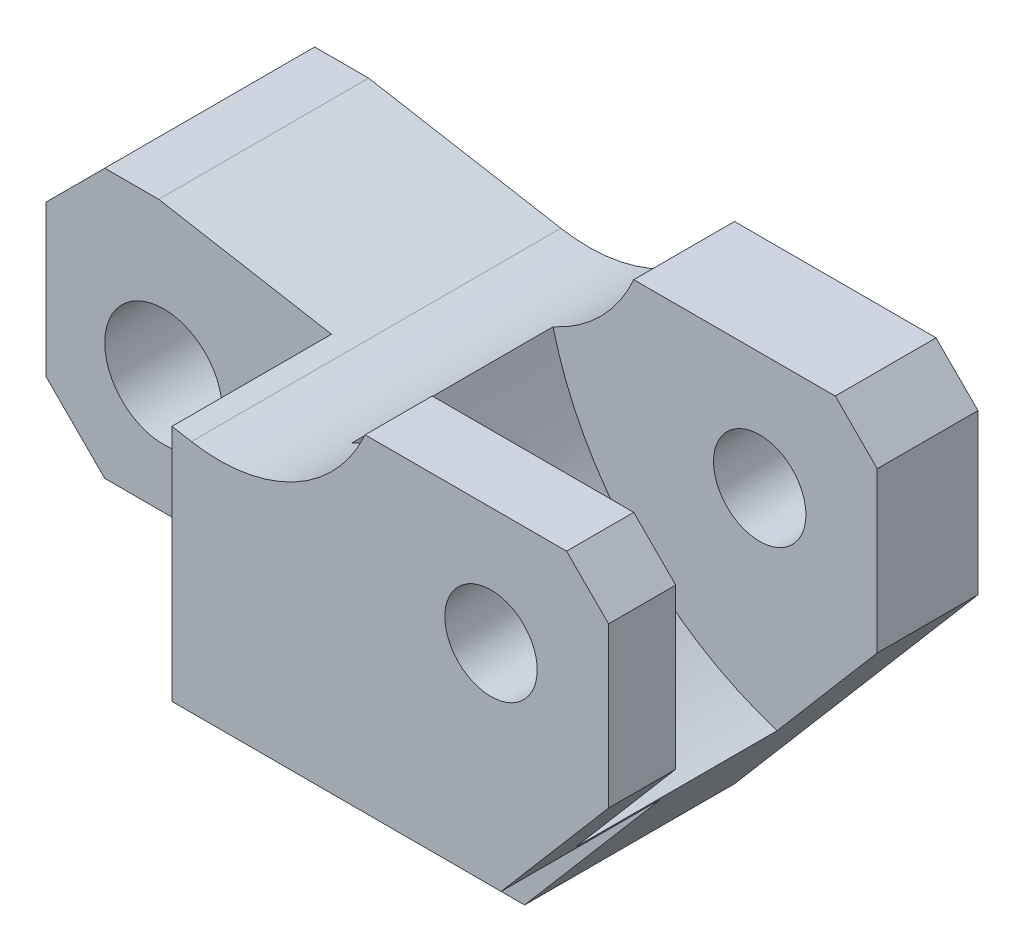
ISO-10303-21;
HEADER;
FILE_DESCRIPTION(('STEP AP214'),'2;1');
FILE_NAME('part.step','',(''),(''),'','','');
FILE_SCHEMA(('AUTOMOTIVE_DESIGN { 1 0 10303 214 1 1 1 1 }'));
ENDSEC;
DATA;
#1=APPLICATION_CONTEXT('core data for automotive mechanical design processes');
#2=APPLICATION_PROTOCOL_DEFINITION('international standard','automotive_design',2000,#1);
#3=PRODUCT_CONTEXT('',#1,'mechanical');
#4=PRODUCT('Part','Part','',(#3));
#5=PRODUCT_RELATED_PRODUCT_CATEGORY('part','',(#4));
#6=PRODUCT_DEFINITION_FORMATION('','',#4);
#7=PRODUCT_DEFINITION_CONTEXT('part definition',#1,'design');
#8=PRODUCT_DEFINITION('design','',#6,#7);
#9=PRODUCT_DEFINITION_SHAPE('','',#8);
#10=(LENGTH_UNIT() NAMED_UNIT(*) SI_UNIT(.MILLI.,.METRE.));
#11=(NAMED_UNIT(*) PLANE_ANGLE_UNIT() SI_UNIT($,.RADIAN.));
#12=(NAMED_UNIT(*) SI_UNIT($,.STERADIAN.) SOLID_ANGLE_UNIT());
#13=UNCERTAINTY_MEASURE_WITH_UNIT(LENGTH_MEASURE(1.E-05),#10,'distance_accuracy_value','');
#14=(GEOMETRIC_REPRESENTATION_CONTEXT(3) GLOBAL_UNCERTAINTY_ASSIGNED_CONTEXT((#13)) GLOBAL_UNIT_ASSIGNED_CONTEXT((#10,
#11,#12)) REPRESENTATION_CONTEXT('',''));
#15=CARTESIAN_POINT('',(0.,0.,0.));
#16=DIRECTION('',(0.,0.,1.));
#17=DIRECTION('',(1.,0.,0.));
#18=AXIS2_PLACEMENT_3D('',#15,#16,#17);
#19=CARTESIAN_POINT('',(79.,34.0000000000003,44.));
#20=DIRECTION('',(-1.,0.,0.));
#21=DIRECTION('',(0.,0.,1.));
#22=AXIS2_PLACEMENT_3D('',#19,#20,#21);
#23=PLANE('',#22);
#24=DIRECTION('',(0.,0.,-1.));
#25=VECTOR('',#24,1.);
#26=CARTESIAN_POINT('',(79.,15.0000000000003,44.));
#27=LINE('',#26,#25);
#28=CARTESIAN_POINT('',(79.,15.0000000000003,44.));
#29=VERTEX_POINT('',#28);
#30=CARTESIAN_POINT('',(79.,15.0000000000003,36.));
#31=VERTEX_POINT('',#30);
#32=EDGE_CURVE('E453',#29,#31,#27,.T.);
#33=ORIENTED_EDGE('',*,*,#32,.T.);
#34=DIRECTION('',(0.,1.,0.));
#35=VECTOR('',#34,1.);
#36=CARTESIAN_POINT('',(79.,34.0000000000003,36.));
#37=LINE('',#36,#35);
#38=CARTESIAN_POINT('',(79.,34.0000000000003,36.));
#39=VERTEX_POINT('',#38);
#40=EDGE_CURVE('E332',#31,#39,#37,.T.);
#41=ORIENTED_EDGE('',*,*,#40,.T.);
#42=DIRECTION('',(0.,0.,-1.));
#43=VECTOR('',#42,1.);
#44=CARTESIAN_POINT('',(79.,34.0000000000003,44.));
#45=LINE('',#44,#43);
#46=CARTESIAN_POINT('',(79.,34.0000000000003,44.));
#47=VERTEX_POINT('',#46);
#48=EDGE_CURVE('E448',#47,#39,#45,.T.);
#49=ORIENTED_EDGE('',*,*,#48,.F.);
#50=DIRECTION('',(0.,1.,0.));
#51=VECTOR('',#50,1.);
#52=CARTESIAN_POINT('',(79.,34.0000000000003,44.));
#53=LINE('',#52,#51);
#54=EDGE_CURVE('E351',#29,#47,#53,.T.);
#55=ORIENTED_EDGE('',*,*,#54,.F.);
#56=EDGE_LOOP('',(#33,#41,#49,#55));
#57=FACE_BOUND('',#56,.T.);
#58=ADVANCED_FACE('F40',(#57),#23,.F.);
#59=CARTESIAN_POINT('',(74.,39.0000000000003,44.));
#60=DIRECTION('',(-0.707106781186547,-0.707106781186548,0.));
#61=DIRECTION('',(0.707106781186548,-0.707106781186547,0.));
#62=AXIS2_PLACEMENT_3D('',#59,#60,#61);
#63=PLANE('',#62);
#64=ORIENTED_EDGE('',*,*,#48,.T.);
#65=DIRECTION('',(-0.707106781186548,0.707106781186547,0.));
#66=VECTOR('',#65,1.);
#67=CARTESIAN_POINT('',(74.,39.0000000000003,36.));
#68=LINE('',#67,#66);
#69=CARTESIAN_POINT('',(74.,39.0000000000003,36.));
#70=VERTEX_POINT('',#69);
#71=EDGE_CURVE('E328',#39,#70,#68,.T.);
#72=ORIENTED_EDGE('',*,*,#71,.T.);
#73=DIRECTION('',(0.,0.,-1.));
#74=VECTOR('',#73,1.);
#75=CARTESIAN_POINT('',(74.,39.0000000000003,44.));
#76=LINE('',#75,#74);
#77=CARTESIAN_POINT('',(74.,39.0000000000003,44.));
#78=VERTEX_POINT('',#77);
#79=EDGE_CURVE('E443',#78,#70,#76,.T.);
#80=ORIENTED_EDGE('',*,*,#79,.F.);
#81=DIRECTION('',(-0.707106781186548,0.707106781186547,0.));
#82=VECTOR('',#81,1.);
#83=CARTESIAN_POINT('',(74.,39.0000000000003,44.));
#84=LINE('',#83,#82);
#85=EDGE_CURVE('E354',#47,#78,#84,.T.);
#86=ORIENTED_EDGE('',*,*,#85,.F.);
#87=EDGE_LOOP('',(#64,#72,#80,#86));
#88=FACE_BOUND('',#87,.T.);
#89=ADVANCED_FACE('F546',(#88),#63,.F.);
#90=CARTESIAN_POINT('',(50.,39.0000000000003,44.));
#91=DIRECTION('',(0.,-1.,0.));
#92=DIRECTION('',(1.,0.,0.));
#93=AXIS2_PLACEMENT_3D('',#90,#91,#92);
#94=PLANE('',#93);
#95=ORIENTED_EDGE('',*,*,#79,.T.);
#96=DIRECTION('',(-1.,0.,0.));
#97=VECTOR('',#96,1.);
#98=CARTESIAN_POINT('',(50.,39.0000000000003,36.));
#99=LINE('',#98,#97);
#100=CARTESIAN_POINT('',(50.,39.0000000000003,36.));
#101=VERTEX_POINT('',#100);
#102=EDGE_CURVE('E324',#70,#101,#99,.T.);
#103=ORIENTED_EDGE('',*,*,#102,.T.);
#104=DIRECTION('',(0.,0.,-1.));
#105=VECTOR('',#104,1.);
#106=CARTESIAN_POINT('',(50.,39.0000000000003,44.));
#107=LINE('',#106,#105);
#108=CARTESIAN_POINT('',(50.,39.0000000000003,44.));
#109=VERTEX_POINT('',#108);
#110=EDGE_CURVE('E438',#109,#101,#107,.T.);
#111=ORIENTED_EDGE('',*,*,#110,.F.);
#112=DIRECTION('',(-1.,0.,0.));
#113=VECTOR('',#112,1.);
#114=CARTESIAN_POINT('',(50.,39.0000000000003,44.));
#115=LINE('',#114,#113);
#116=EDGE_CURVE('E357',#78,#109,#115,.T.);
#117=ORIENTED_EDGE('',*,*,#116,.F.);
#118=EDGE_LOOP('',(#95,#103,#111,#117));
#119=FACE_BOUND('',#118,.T.);
#120=ADVANCED_FACE('F543',(#119),#94,.F.);
#121=CARTESIAN_POINT('',(32.6187452989159,46.6741113502506,44.));
#122=DIRECTION('',(0.,0.,-1.));
#123=DIRECTION('',(-1.,0.,0.));
#124=AXIS2_PLACEMENT_3D('',#121,#122,#123);
#125=PLANE('',#124);
#126=CARTESIAN_POINT('',(65.,25.0000000000003,44.));
#127=DIRECTION('',(0.,0.,1.));
#128=DIRECTION('',(1.,0.,0.));
#129=AXIS2_PLACEMENT_3D('',#126,#127,#128);
#130=CIRCLE('',#129,5.5);
#131=CARTESIAN_POINT('',(70.5,25.0000000000003,44.));
#132=VERTEX_POINT('',#131);
#133=EDGE_CURVE('E249',#132,#132,#130,.T.);
#134=ORIENTED_EDGE('',*,*,#133,.F.);
#135=EDGE_LOOP('',(#134));
#136=FACE_BOUND('',#135,.T.);
#137=DIRECTION('',(1.,0.,0.));
#138=VECTOR('',#137,1.);
#139=CARTESIAN_POINT('',(32.9488407975828,0.,44.));
#140=LINE('',#139,#138);
#141=CARTESIAN_POINT('',(27.,0.,44.));
#142=VERTEX_POINT('',#141);
#143=CARTESIAN_POINT('',(66.2058823529412,2.84494650060196E-13,44.));
#144=VERTEX_POINT('',#143);
#145=EDGE_CURVE('E344',#142,#144,#140,.T.);
#146=ORIENTED_EDGE('',*,*,#145,.T.);
#147=DIRECTION('',(0.64894660608275,0.760833951959086,0.));
#148=VECTOR('',#147,1.);
#149=CARTESIAN_POINT('',(79.,15.0000000000003,44.));
#150=LINE('',#149,#148);
#151=EDGE_CURVE('E347',#144,#29,#150,.T.);
#152=ORIENTED_EDGE('',*,*,#151,.T.);
#153=ORIENTED_EDGE('',*,*,#54,.T.);
#154=ORIENTED_EDGE('',*,*,#85,.T.);
#155=ORIENTED_EDGE('',*,*,#116,.T.);
#156=CARTESIAN_POINT('',(32.6187452989159,46.6741113502506,44.));
#157=DIRECTION('',(0.,0.,-1.));
#158=DIRECTION('',(-1.,0.,0.));
#159=AXIS2_PLACEMENT_3D('',#156,#157,#158);
#160=CIRCLE('',#159,19.);
#161=CARTESIAN_POINT('',(29.3194299232442,27.9627640430187,44.));
#162=VERTEX_POINT('',#161);
#163=EDGE_CURVE('E360',#109,#162,#160,.T.);
#164=ORIENTED_EDGE('',*,*,#163,.T.);
#165=DIRECTION('',(-0.984807753012208,0.17364817766693,0.));
#166=VECTOR('',#165,1.);
#167=CARTESIAN_POINT('',(6.42312703890897,32.,44.));
#168=LINE('',#167,#166);
#169=CARTESIAN_POINT('',(27.,28.3717421183492,44.));
#170=VERTEX_POINT('',#169);
#171=EDGE_CURVE('E363',#162,#170,#168,.T.);
#172=ORIENTED_EDGE('',*,*,#171,.T.);
#173=DIRECTION('',(0.,1.,0.));
#174=VECTOR('',#173,1.);
#175=CARTESIAN_POINT('',(27.,-3.99999999999971,44.));
#176=LINE('',#175,#174);
#177=EDGE_CURVE('E255',#142,#170,#176,.T.);
#178=ORIENTED_EDGE('',*,*,#177,.F.);
#179=EDGE_LOOP('',(#146,#152,#153,#154,#155,#164,#172,#178));
#180=FACE_BOUND('',#179,.T.);
#181=ADVANCED_FACE('F487',(#136,#180),#125,.F.);
#182=CARTESIAN_POINT('',(32.6187452989159,46.6741113502506,0.));
#183=DIRECTION('',(0.,0.,-1.));
#184=DIRECTION('',(-1.,0.,0.));
#185=AXIS2_PLACEMENT_3D('',#182,#183,#184);
#186=PLANE('',#185);
#187=CARTESIAN_POINT('',(65.,25.0000000000003,0.));
#188=DIRECTION('',(0.,0.,1.));
#189=DIRECTION('',(1.,0.,0.));
#190=AXIS2_PLACEMENT_3D('',#187,#188,#189);
#191=CIRCLE('',#190,5.5);
#192=CARTESIAN_POINT('',(70.5,25.0000000000003,0.));
#193=VERTEX_POINT('',#192);
#194=EDGE_CURVE('E213',#193,#193,#191,.T.);
#195=ORIENTED_EDGE('',*,*,#194,.T.);
#196=EDGE_LOOP('',(#195));
#197=FACE_BOUND('',#196,.T.);
#198=DIRECTION('',(1.,0.,0.));
#199=VECTOR('',#198,1.);
#200=CARTESIAN_POINT('',(32.9488407975828,0.,0.));
#201=LINE('',#200,#199);
#202=CARTESIAN_POINT('',(0.,0.,0.));
#203=VERTEX_POINT('',#202);
#204=CARTESIAN_POINT('',(32.9488407975828,0.,0.));
#205=VERTEX_POINT('',#204);
#206=EDGE_CURVE('E218',#203,#205,#201,.T.);
#207=ORIENTED_EDGE('',*,*,#206,.F.);
#208=DIRECTION('',(0.707106781186549,-0.707106781186546,0.));
#209=VECTOR('',#208,1.);
#210=CARTESIAN_POINT('',(0.,0.,0.));
#211=LINE('',#210,#209);
#212=CARTESIAN_POINT('',(-7.,6.99999999999997,0.));
#213=VERTEX_POINT('',#212);
#214=EDGE_CURVE('E348',#213,#203,#211,.T.);
#215=ORIENTED_EDGE('',*,*,#214,.F.);
#216=DIRECTION('',(0.,-1.,0.));
#217=VECTOR('',#216,1.);
#218=CARTESIAN_POINT('',(-7.,6.99999999999997,0.));
#219=LINE('',#218,#217);
#220=CARTESIAN_POINT('',(-7.,25.,0.));
#221=VERTEX_POINT('',#220);
#222=EDGE_CURVE('E412',#221,#213,#219,.T.);
#223=ORIENTED_EDGE('',*,*,#222,.F.);
#224=DIRECTION('',(-0.707106781186546,-0.707106781186549,0.));
#225=VECTOR('',#224,1.);
#226=CARTESIAN_POINT('',(-7.,25.,0.));
#227=LINE('',#226,#225);
#228=CARTESIAN_POINT('',(0.,32.,0.));
#229=VERTEX_POINT('',#228);
#230=EDGE_CURVE('E408',#229,#221,#227,.T.);
#231=ORIENTED_EDGE('',*,*,#230,.F.);
#232=DIRECTION('',(-1.,0.,0.));
#233=VECTOR('',#232,1.);
#234=CARTESIAN_POINT('',(0.,32.,0.));
#235=LINE('',#234,#233);
#236=CARTESIAN_POINT('',(6.42312703890897,32.,0.));
#237=VERTEX_POINT('',#236);
#238=EDGE_CURVE('E404',#237,#229,#235,.T.);
#239=ORIENTED_EDGE('',*,*,#238,.F.);
#240=DIRECTION('',(-0.984807753012208,0.17364817766693,0.));
#241=VECTOR('',#240,1.);
#242=CARTESIAN_POINT('',(6.42312703890897,32.,0.));
#243=LINE('',#242,#241);
#244=CARTESIAN_POINT('',(29.3194299232442,27.9627640430187,0.));
#245=VERTEX_POINT('',#244);
#246=EDGE_CURVE('E400',#245,#237,#243,.T.);
#247=ORIENTED_EDGE('',*,*,#246,.F.);
#248=CARTESIAN_POINT('',(32.6187452989159,46.6741113502506,0.));
#249=DIRECTION('',(0.,0.,-1.));
#250=DIRECTION('',(-1.,0.,0.));
#251=AXIS2_PLACEMENT_3D('',#248,#249,#250);
#252=CIRCLE('',#251,19.);
#253=CARTESIAN_POINT('',(50.,39.0000000000003,0.));
#254=VERTEX_POINT('',#253);
#255=EDGE_CURVE('E397',#254,#245,#252,.T.);
#256=ORIENTED_EDGE('',*,*,#255,.F.);
#257=DIRECTION('',(-1.,0.,0.));
#258=VECTOR('',#257,1.);
#259=CARTESIAN_POINT('',(50.,39.0000000000003,0.));
#260=LINE('',#259,#258);
#261=CARTESIAN_POINT('',(74.,39.0000000000003,0.));
#262=VERTEX_POINT('',#261);
#263=EDGE_CURVE('E393',#262,#254,#260,.T.);
#264=ORIENTED_EDGE('',*,*,#263,.F.);
#265=DIRECTION('',(-0.707106781186548,0.707106781186547,0.));
#266=VECTOR('',#265,1.);
#267=CARTESIAN_POINT('',(74.,39.0000000000003,0.));
#268=LINE('',#267,#266);
#269=CARTESIAN_POINT('',(79.,34.0000000000003,0.));
#270=VERTEX_POINT('',#269);
#271=EDGE_CURVE('E389',#270,#262,#268,.T.);
#272=ORIENTED_EDGE('',*,*,#271,.F.);
#273=DIRECTION('',(0.,1.,0.));
#274=VECTOR('',#273,1.);
#275=CARTESIAN_POINT('',(79.,34.0000000000003,0.));
#276=LINE('',#275,#274);
#277=CARTESIAN_POINT('',(79.,15.0000000000003,0.));
#278=VERTEX_POINT('',#277);
#279=EDGE_CURVE('E385',#278,#270,#276,.T.);
#280=ORIENTED_EDGE('',*,*,#279,.F.);
#281=DIRECTION('',(0.64894660608275,0.760833951959086,0.));
#282=VECTOR('',#281,1.);
#283=CARTESIAN_POINT('',(79.,15.0000000000003,0.));
#284=LINE('',#283,#282);
#285=CARTESIAN_POINT('',(50.,-18.9999999999997,0.));
#286=VERTEX_POINT('',#285);
#287=EDGE_CURVE('E381',#286,#278,#284,.T.);
#288=ORIENTED_EDGE('',*,*,#287,.F.);
#289=DIRECTION('',(1.,0.,0.));
#290=VECTOR('',#289,1.);
#291=CARTESIAN_POINT('',(50.,-18.9999999999997,0.));
#292=LINE('',#291,#290);
#293=CARTESIAN_POINT('',(44.788067396763,-18.9999999999997,0.));
#294=VERTEX_POINT('',#293);
#295=EDGE_CURVE('E377',#294,#286,#292,.T.);
#296=ORIENTED_EDGE('',*,*,#295,.F.);
#297=CARTESIAN_POINT('',(66.2058823529412,2.89002313944685E-13,0.));
#298=DIRECTION('',(0.,0.,1.));
#299=DIRECTION('',(-1.,0.,0.));
#300=AXIS2_PLACEMENT_3D('',#297,#298,#299);
#301=CIRCLE('',#300,28.6308015517745);
#302=CARTESIAN_POINT('',(37.8932726904949,-4.25663383426904,0.));
#303=VERTEX_POINT('',#302);
#304=EDGE_CURVE('E373',#303,#294,#301,.T.);
#305=ORIENTED_EDGE('',*,*,#304,.F.);
#306=CARTESIAN_POINT('',(32.9488407975828,-5.,0.));
#307=DIRECTION('',(0.,0.,-1.));
#308=DIRECTION('',(1.,0.,0.));
#309=AXIS2_PLACEMENT_3D('',#306,#307,#308);
#310=CIRCLE('',#309,5.);
#311=EDGE_CURVE('E370',#205,#303,#310,.T.);
#312=ORIENTED_EDGE('',*,*,#311,.F.);
#313=EDGE_LOOP('',(#207,#215,#223,#231,#239,#247,#256,#264,#272,#280,#288,#296,#305,#312));
#314=FACE_BOUND('',#313,.T.);
#315=CARTESIAN_POINT('',(7.,14.,0.));
#316=DIRECTION('',(0.,0.,1.));
#317=DIRECTION('',(1.,0.,0.));
#318=AXIS2_PLACEMENT_3D('',#315,#316,#317);
#319=CIRCLE('',#318,7.);
#320=CARTESIAN_POINT('',(14.,14.,0.));
#321=VERTEX_POINT('',#320);
#322=EDGE_CURVE('E340',#321,#321,#319,.T.);
#323=ORIENTED_EDGE('',*,*,#322,.T.);
#324=EDGE_LOOP('',(#323));
#325=FACE_BOUND('',#324,.T.);
#326=ADVANCED_FACE('F470',(#197,#314,#325),#186,.T.);
#327=CARTESIAN_POINT('',(32.9488407975828,0.,44.));
#328=DIRECTION('',(0.,1.,0.));
#329=DIRECTION('',(0.,0.,1.));
#330=AXIS2_PLACEMENT_3D('',#327,#328,#329);
#331=PLANE('',#330);
#332=DIRECTION('',(0.,0.,-1.));
#333=VECTOR('',#332,1.);
#334=CARTESIAN_POINT('',(32.9488407975828,0.,44.));
#335=LINE('',#334,#333);
#336=CARTESIAN_POINT('',(32.9488407975828,2.84494650060196E-13,25.));
#337=VERTEX_POINT('',#336);
#338=EDGE_CURVE('E209',#337,#205,#335,.T.);
#339=ORIENTED_EDGE('',*,*,#338,.F.);
#340=DIRECTION('',(1.,0.,0.));
#341=VECTOR('',#340,1.);
#342=CARTESIAN_POINT('',(-6.99999999999999,2.84494650060196E-13,25.));
#343=LINE('',#342,#341);
#344=CARTESIAN_POINT('',(66.2058823529412,2.8796409701215E-13,25.));
#345=VERTEX_POINT('',#344);
#346=EDGE_CURVE('E193',#337,#345,#343,.T.);
#347=ORIENTED_EDGE('',*,*,#346,.T.);
#348=DIRECTION('',(0.,0.,-1.));
#349=VECTOR('',#348,1.);
#350=CARTESIAN_POINT('',(66.2058823529412,2.84494650060196E-13,44.));
#351=LINE('',#350,#349);
#352=EDGE_CURVE('E203',#144,#345,#351,.T.);
#353=ORIENTED_EDGE('',*,*,#352,.F.);
#354=ORIENTED_EDGE('',*,*,#145,.F.);
#355=DIRECTION('',(0.,0.,-1.));
#356=VECTOR('',#355,1.);
#357=CARTESIAN_POINT('',(27.,0.,44.));
#358=LINE('',#357,#356);
#359=CARTESIAN_POINT('',(27.,0.,25.));
#360=VERTEX_POINT('',#359);
#361=EDGE_CURVE('E292',#142,#360,#358,.T.);
#362=ORIENTED_EDGE('',*,*,#361,.T.);
#363=DIRECTION('',(-1.,0.,0.));
#364=VECTOR('',#363,1.);
#365=CARTESIAN_POINT('',(32.9488407975828,0.,25.));
#366=LINE('',#365,#364);
#367=CARTESIAN_POINT('',(0.,0.,25.));
#368=VERTEX_POINT('',#367);
#369=EDGE_CURVE('E276',#360,#368,#366,.T.);
#370=ORIENTED_EDGE('',*,*,#369,.T.);
#371=DIRECTION('',(0.,0.,-1.));
#372=VECTOR('',#371,1.);
#373=CARTESIAN_POINT('',(0.,0.,44.));
#374=LINE('',#373,#372);
#375=EDGE_CURVE('E367',#368,#203,#374,.T.);
#376=ORIENTED_EDGE('',*,*,#375,.T.);
#377=ORIENTED_EDGE('',*,*,#206,.T.);
#378=EDGE_LOOP('',(#339,#347,#353,#354,#362,#370,#376,#377));
#379=FACE_BOUND('',#378,.T.);
#380=ADVANCED_FACE('F42',(#379),#331,.F.);
#381=CARTESIAN_POINT('',(32.9488407975828,-5.,44.));
#382=DIRECTION('',(0.,0.,-1.));
#383=DIRECTION('',(-1.,0.,0.));
#384=AXIS2_PLACEMENT_3D('',#381,#382,#383);
#385=CYLINDRICAL_SURFACE('',#384,5.);
#386=DIRECTION('',(0.,0.,-1.));
#387=VECTOR('',#386,1.);
#388=CARTESIAN_POINT('',(37.8932726904949,-4.25663383426904,44.));
#389=LINE('',#388,#387);
#390=CARTESIAN_POINT('',(37.8932726904949,-4.25663383426904,25.));
#391=VERTEX_POINT('',#390);
#392=EDGE_CURVE('E211',#391,#303,#389,.T.);
#393=ORIENTED_EDGE('',*,*,#392,.F.);
#394=CARTESIAN_POINT('',(32.9488407975828,-5.,25.));
#395=DIRECTION('',(0.,0.,-1.));
#396=DIRECTION('',(-1.,0.,0.));
#397=AXIS2_PLACEMENT_3D('',#394,#395,#396);
#398=CIRCLE('',#397,5.);
#399=EDGE_CURVE('E196',#391,#337,#398,.F.);
#400=ORIENTED_EDGE('',*,*,#399,.T.);
#401=ORIENTED_EDGE('',*,*,#338,.T.);
#402=ORIENTED_EDGE('',*,*,#311,.T.);
#403=EDGE_LOOP('',(#393,#400,#401,#402));
#404=FACE_BOUND('',#403,.T.);
#405=ADVANCED_FACE('F207',(#404),#385,.F.);
#406=CARTESIAN_POINT('',(66.2058823529412,2.89002313944685E-13,44.));
#407=DIRECTION('',(0.,0.,-1.));
#408=DIRECTION('',(-1.,0.,0.));
#409=AXIS2_PLACEMENT_3D('',#406,#407,#408);
#410=CYLINDRICAL_SURFACE('',#409,28.6308015517745);
#411=DIRECTION('',(0.,0.,-1.));
#412=VECTOR('',#411,1.);
#413=CARTESIAN_POINT('',(44.788067396763,-18.9999999999997,44.));
#414=LINE('',#413,#412);
#415=CARTESIAN_POINT('',(44.788067396763,-18.9999999999997,25.));
#416=VERTEX_POINT('',#415);
#417=EDGE_CURVE('E227',#416,#294,#414,.T.);
#418=ORIENTED_EDGE('',*,*,#417,.F.);
#419=CARTESIAN_POINT('',(66.2058823529412,2.89002313944685E-13,25.));
#420=DIRECTION('',(0.,0.,-1.));
#421=DIRECTION('',(-1.,0.,0.));
#422=AXIS2_PLACEMENT_3D('',#419,#420,#421);
#423=CIRCLE('',#422,28.6308015517745);
#424=EDGE_CURVE('E214',#416,#391,#423,.T.);
#425=ORIENTED_EDGE('',*,*,#424,.T.);
#426=ORIENTED_EDGE('',*,*,#392,.T.);
#427=ORIENTED_EDGE('',*,*,#304,.T.);
#428=EDGE_LOOP('',(#418,#425,#426,#427));
#429=FACE_BOUND('',#428,.T.);
#430=ADVANCED_FACE('F468',(#429),#410,.T.);
#431=CARTESIAN_POINT('',(50.,-18.9999999999997,44.));
#432=DIRECTION('',(0.,1.,0.));
#433=DIRECTION('',(0.,0.,1.));
#434=AXIS2_PLACEMENT_3D('',#431,#432,#433);
#435=PLANE('',#434);
#436=DIRECTION('',(0.,0.,-1.));
#437=VECTOR('',#436,1.);
#438=CARTESIAN_POINT('',(50.,-18.9999999999997,44.));
#439=LINE('',#438,#437);
#440=CARTESIAN_POINT('',(50.,-18.9999999999997,25.));
#441=VERTEX_POINT('',#440);
#442=EDGE_CURVE('E457',#441,#286,#439,.T.);
#443=ORIENTED_EDGE('',*,*,#442,.F.);
#444=DIRECTION('',(1.,0.,0.));
#445=VECTOR('',#444,1.);
#446=CARTESIAN_POINT('',(-6.99999999999999,-18.9999999999997,25.));
#447=LINE('',#446,#445);
#448=EDGE_CURVE('E56',#416,#441,#447,.T.);
#449=ORIENTED_EDGE('',*,*,#448,.F.);
#450=ORIENTED_EDGE('',*,*,#417,.T.);
#451=ORIENTED_EDGE('',*,*,#295,.T.);
#452=EDGE_LOOP('',(#443,#449,#450,#451));
#453=FACE_BOUND('',#452,.T.);
#454=ADVANCED_FACE('F463',(#453),#435,.F.);
#455=CARTESIAN_POINT('',(79.,15.0000000000003,44.));
#456=DIRECTION('',(-0.760833951959086,0.64894660608275,0.));
#457=DIRECTION('',(-0.64894660608275,-0.760833951959086,0.));
#458=AXIS2_PLACEMENT_3D('',#455,#456,#457);
#459=PLANE('',#458);
#460=ORIENTED_EDGE('',*,*,#151,.F.);
#461=ORIENTED_EDGE('',*,*,#352,.T.);
#462=DIRECTION('',(-0.64894660608275,-0.760833951959086,0.));
#463=VECTOR('',#462,1.);
#464=CARTESIAN_POINT('',(79.,15.0000000000003,25.));
#465=LINE('',#464,#463);
#466=EDGE_CURVE('E11',#345,#441,#465,.T.);
#467=ORIENTED_EDGE('',*,*,#466,.T.);
#468=ORIENTED_EDGE('',*,*,#442,.T.);
#469=ORIENTED_EDGE('',*,*,#287,.T.);
#470=CARTESIAN_POINT('',(79.,15.0000000000003,12.));
#471=VERTEX_POINT('',#470);
#472=EDGE_CURVE('E452',#471,#278,#27,.T.);
#473=ORIENTED_EDGE('',*,*,#472,.F.);
#474=DIRECTION('',(-0.64894660608275,-0.760833951959086,0.));
#475=VECTOR('',#474,1.);
#476=CARTESIAN_POINT('',(79.,15.0000000000003,12.));
#477=LINE('',#476,#475);
#478=CARTESIAN_POINT('',(67.0788343916599,1.02346101091188,12.));
#479=VERTEX_POINT('',#478);
#480=EDGE_CURVE('E316',#471,#479,#477,.T.);
#481=ORIENTED_EDGE('',*,*,#480,.T.);
#482=DIRECTION('',(0.,0.,1.));
#483=VECTOR('',#482,1.);
#484=CARTESIAN_POINT('',(67.0788343916599,1.02346101091187,36.));
#485=LINE('',#484,#483);
#486=CARTESIAN_POINT('',(67.0788343916599,1.02346101091187,36.));
#487=VERTEX_POINT('',#486);
#488=EDGE_CURVE('E320',#479,#487,#485,.T.);
#489=ORIENTED_EDGE('',*,*,#488,.T.);
#490=DIRECTION('',(0.64894660608275,0.760833951959086,0.));
#491=VECTOR('',#490,1.);
#492=CARTESIAN_POINT('',(79.,15.0000000000003,36.));
#493=LINE('',#492,#491);
#494=EDGE_CURVE('E336',#487,#31,#493,.T.);
#495=ORIENTED_EDGE('',*,*,#494,.T.);
#496=ORIENTED_EDGE('',*,*,#32,.F.);
#497=EDGE_LOOP('',(#460,#461,#467,#468,#469,#473,#481,#489,#495,#496));
#498=FACE_BOUND('',#497,.T.);
#499=ADVANCED_FACE('F477',(#498),#459,.F.);
#500=CARTESIAN_POINT('',(79.,34.0000000000003,12.));
#501=VERTEX_POINT('',#500);
#502=EDGE_CURVE('E447',#501,#270,#45,.T.);
#503=ORIENTED_EDGE('',*,*,#502,.F.);
#504=DIRECTION('',(0.,-1.,0.));
#505=VECTOR('',#504,1.);
#506=CARTESIAN_POINT('',(79.,34.0000000000003,12.));
#507=LINE('',#506,#505);
#508=EDGE_CURVE('E312',#501,#471,#507,.T.);
#509=ORIENTED_EDGE('',*,*,#508,.T.);
#510=ORIENTED_EDGE('',*,*,#472,.T.);
#511=ORIENTED_EDGE('',*,*,#279,.T.);
#512=EDGE_LOOP('',(#503,#509,#510,#511));
#513=FACE_BOUND('',#512,.T.);
#514=ADVANCED_FACE('F529',(#513),#23,.F.);
#515=CARTESIAN_POINT('',(74.,39.0000000000003,12.));
#516=VERTEX_POINT('',#515);
#517=EDGE_CURVE('E442',#516,#262,#76,.T.);
#518=ORIENTED_EDGE('',*,*,#517,.F.);
#519=DIRECTION('',(0.707106781186548,-0.707106781186547,0.));
#520=VECTOR('',#519,1.);
#521=CARTESIAN_POINT('',(74.,39.0000000000003,12.));
#522=LINE('',#521,#520);
#523=EDGE_CURVE('E308',#516,#501,#522,.T.);
#524=ORIENTED_EDGE('',*,*,#523,.T.);
#525=ORIENTED_EDGE('',*,*,#502,.T.);
#526=ORIENTED_EDGE('',*,*,#271,.T.);
#527=EDGE_LOOP('',(#518,#524,#525,#526));
#528=FACE_BOUND('',#527,.T.);
#529=ADVANCED_FACE('F525',(#528),#63,.F.);
#530=CARTESIAN_POINT('',(50.,39.0000000000003,12.));
#531=VERTEX_POINT('',#530);
#532=EDGE_CURVE('E437',#531,#254,#107,.T.);
#533=ORIENTED_EDGE('',*,*,#532,.F.);
#534=DIRECTION('',(1.,0.,0.));
#535=VECTOR('',#534,1.);
#536=CARTESIAN_POINT('',(50.,39.0000000000003,12.));
#537=LINE('',#536,#535);
#538=EDGE_CURVE('E304',#531,#516,#537,.T.);
#539=ORIENTED_EDGE('',*,*,#538,.T.);
#540=ORIENTED_EDGE('',*,*,#517,.T.);
#541=ORIENTED_EDGE('',*,*,#263,.T.);
#542=EDGE_LOOP('',(#533,#539,#540,#541));
#543=FACE_BOUND('',#542,.T.);
#544=ADVANCED_FACE('F522',(#543),#94,.F.);
#545=CARTESIAN_POINT('',(32.6187452989159,46.6741113502506,44.));
#546=DIRECTION('',(0.,0.,-1.));
#547=DIRECTION('',(-1.,0.,0.));
#548=AXIS2_PLACEMENT_3D('',#545,#546,#547);
#549=CYLINDRICAL_SURFACE('',#548,19.);
#550=ORIENTED_EDGE('',*,*,#110,.T.);
#551=CARTESIAN_POINT('',(32.6187452989159,46.6741113502506,36.));
#552=DIRECTION('',(0.,0.,1.));
#553=DIRECTION('',(1.,0.,0.));
#554=AXIS2_PLACEMENT_3D('',#551,#552,#553);
#555=CIRCLE('',#554,19.);
#556=CARTESIAN_POINT('',(40.3875769388199,29.3349863737466,36.));
#557=VERTEX_POINT('',#556);
#558=EDGE_CURVE('E234',#101,#557,#555,.F.);
#559=ORIENTED_EDGE('',*,*,#558,.T.);
#560=DIRECTION('',(0.,0.,1.));
#561=VECTOR('',#560,1.);
#562=CARTESIAN_POINT('',(40.3875769388199,29.3349863737466,24.));
#563=LINE('',#562,#561);
#564=CARTESIAN_POINT('',(40.3875769388199,29.3349863737466,12.));
#565=VERTEX_POINT('',#564);
#566=EDGE_CURVE('E225',#557,#565,#563,.F.);
#567=ORIENTED_EDGE('',*,*,#566,.T.);
#568=CARTESIAN_POINT('',(32.6187452989159,46.6741113502506,12.));
#569=DIRECTION('',(0.,0.,-1.));
#570=DIRECTION('',(-1.,0.,0.));
#571=AXIS2_PLACEMENT_3D('',#568,#569,#570);
#572=CIRCLE('',#571,19.);
#573=EDGE_CURVE('E220',#565,#531,#572,.F.);
#574=ORIENTED_EDGE('',*,*,#573,.T.);
#575=ORIENTED_EDGE('',*,*,#532,.T.);
#576=ORIENTED_EDGE('',*,*,#255,.T.);
#577=DIRECTION('',(0.,0.,-1.));
#578=VECTOR('',#577,1.);
#579=CARTESIAN_POINT('',(29.3194299232442,27.9627640430187,44.));
#580=LINE('',#579,#578);
#581=EDGE_CURVE('E433',#162,#245,#580,.T.);
#582=ORIENTED_EDGE('',*,*,#581,.F.);
#583=ORIENTED_EDGE('',*,*,#163,.F.);
#584=EDGE_LOOP('',(#550,#559,#567,#574,#575,#576,#582,#583));
#585=FACE_BOUND('',#584,.T.);
#586=ADVANCED_FACE('F518',(#585),#549,.F.);
#587=CARTESIAN_POINT('',(6.42312703890897,32.,44.));
#588=DIRECTION('',(-0.17364817766693,-0.984807753012208,0.));
#589=DIRECTION('',(0.984807753012208,-0.17364817766693,0.));
#590=AXIS2_PLACEMENT_3D('',#587,#588,#589);
#591=PLANE('',#590);
#592=DIRECTION('',(0.,0.,-1.));
#593=VECTOR('',#592,1.);
#594=CARTESIAN_POINT('',(6.42312703890897,32.,44.));
#595=LINE('',#594,#593);
#596=CARTESIAN_POINT('',(6.42312703890897,32.,25.));
#597=VERTEX_POINT('',#596);
#598=EDGE_CURVE('E430',#597,#237,#595,.T.);
#599=ORIENTED_EDGE('',*,*,#598,.F.);
#600=DIRECTION('',(0.984807753012208,-0.17364817766693,0.));
#601=VECTOR('',#600,1.);
#602=CARTESIAN_POINT('',(6.42312703890897,32.,25.));
#603=LINE('',#602,#601);
#604=CARTESIAN_POINT('',(27.,28.3717421183492,25.));
#605=VERTEX_POINT('',#604);
#606=EDGE_CURVE('E288',#597,#605,#603,.T.);
#607=ORIENTED_EDGE('',*,*,#606,.T.);
#608=DIRECTION('',(0.,0.,1.));
#609=VECTOR('',#608,1.);
#610=CARTESIAN_POINT('',(27.,28.3717421183492,44.));
#611=LINE('',#610,#609);
#612=EDGE_CURVE('E49',#605,#170,#611,.T.);
#613=ORIENTED_EDGE('',*,*,#612,.T.);
#614=ORIENTED_EDGE('',*,*,#171,.F.);
#615=ORIENTED_EDGE('',*,*,#581,.T.);
#616=ORIENTED_EDGE('',*,*,#246,.T.);
#617=EDGE_LOOP('',(#599,#607,#613,#614,#615,#616));
#618=FACE_BOUND('',#617,.T.);
#619=ADVANCED_FACE('F494',(#618),#591,.F.);
#620=CARTESIAN_POINT('',(0.,32.,44.));
#621=DIRECTION('',(0.,-1.,0.));
#622=DIRECTION('',(0.,0.,-1.));
#623=AXIS2_PLACEMENT_3D('',#620,#621,#622);
#624=PLANE('',#623);
#625=DIRECTION('',(0.,0.,-1.));
#626=VECTOR('',#625,1.);
#627=CARTESIAN_POINT('',(0.,32.,44.));
#628=LINE('',#627,#626);
#629=CARTESIAN_POINT('',(0.,32.,25.));
#630=VERTEX_POINT('',#629);
#631=EDGE_CURVE('E427',#630,#229,#628,.T.);
#632=ORIENTED_EDGE('',*,*,#631,.F.);
#633=DIRECTION('',(1.,0.,0.));
#634=VECTOR('',#633,1.);
#635=CARTESIAN_POINT('',(0.,32.,25.));
#636=LINE('',#635,#634);
#637=EDGE_CURVE('E284',#630,#597,#636,.T.);
#638=ORIENTED_EDGE('',*,*,#637,.T.);
#639=ORIENTED_EDGE('',*,*,#598,.T.);
#640=ORIENTED_EDGE('',*,*,#238,.T.);
#641=EDGE_LOOP('',(#632,#638,#639,#640));
#642=FACE_BOUND('',#641,.T.);
#643=ADVANCED_FACE('F498',(#642),#624,.F.);
#644=CARTESIAN_POINT('',(-7.,25.,44.));
#645=DIRECTION('',(0.707106781186549,-0.707106781186546,0.));
#646=DIRECTION('',(0.707106781186546,0.707106781186549,0.));
#647=AXIS2_PLACEMENT_3D('',#644,#645,#646);
#648=PLANE('',#647);
#649=DIRECTION('',(0.,0.,-1.));
#650=VECTOR('',#649,1.);
#651=CARTESIAN_POINT('',(-7.,25.,44.));
#652=LINE('',#651,#650);
#653=CARTESIAN_POINT('',(-7.,25.,25.));
#654=VERTEX_POINT('',#653);
#655=EDGE_CURVE('E424',#654,#221,#652,.T.);
#656=ORIENTED_EDGE('',*,*,#655,.F.);
#657=DIRECTION('',(0.707106781186546,0.707106781186549,0.));
#658=VECTOR('',#657,1.);
#659=CARTESIAN_POINT('',(-7.,25.,25.));
#660=LINE('',#659,#658);
#661=EDGE_CURVE('E280',#654,#630,#660,.T.);
#662=ORIENTED_EDGE('',*,*,#661,.T.);
#663=ORIENTED_EDGE('',*,*,#631,.T.);
#664=ORIENTED_EDGE('',*,*,#230,.T.);
#665=EDGE_LOOP('',(#656,#662,#663,#664));
#666=FACE_BOUND('',#665,.T.);
#667=ADVANCED_FACE('F503',(#666),#648,.F.);
#668=CARTESIAN_POINT('',(-7.,6.99999999999997,44.));
#669=DIRECTION('',(1.,0.,0.));
#670=DIRECTION('',(0.,1.,0.));
#671=AXIS2_PLACEMENT_3D('',#668,#669,#670);
#672=PLANE('',#671);
#673=DIRECTION('',(0.,0.,-1.));
#674=VECTOR('',#673,1.);
#675=CARTESIAN_POINT('',(-7.,6.99999999999997,44.));
#676=LINE('',#675,#674);
#677=CARTESIAN_POINT('',(-7.,6.99999999999997,25.));
#678=VERTEX_POINT('',#677);
#679=EDGE_CURVE('E421',#678,#213,#676,.T.);
#680=ORIENTED_EDGE('',*,*,#679,.F.);
#681=DIRECTION('',(0.,1.,0.));
#682=VECTOR('',#681,1.);
#683=CARTESIAN_POINT('',(-7.00000000000001,-3.9999999999997,25.));
#684=LINE('',#683,#682);
#685=EDGE_CURVE('E63',#678,#654,#684,.T.);
#686=ORIENTED_EDGE('',*,*,#685,.T.);
#687=ORIENTED_EDGE('',*,*,#655,.T.);
#688=ORIENTED_EDGE('',*,*,#222,.T.);
#689=EDGE_LOOP('',(#680,#686,#687,#688));
#690=FACE_BOUND('',#689,.T.);
#691=ADVANCED_FACE('F507',(#690),#672,.F.);
#692=CARTESIAN_POINT('',(0.,0.,44.));
#693=DIRECTION('',(0.707106781186546,0.707106781186549,0.));
#694=DIRECTION('',(-0.707106781186549,0.707106781186546,0.));
#695=AXIS2_PLACEMENT_3D('',#692,#693,#694);
#696=PLANE('',#695);
#697=ORIENTED_EDGE('',*,*,#375,.F.);
#698=DIRECTION('',(-0.707106781186549,0.707106781186546,0.));
#699=VECTOR('',#698,1.);
#700=CARTESIAN_POINT('',(0.,0.,25.));
#701=LINE('',#700,#699);
#702=EDGE_CURVE('E242',#368,#678,#701,.T.);
#703=ORIENTED_EDGE('',*,*,#702,.T.);
#704=ORIENTED_EDGE('',*,*,#679,.T.);
#705=ORIENTED_EDGE('',*,*,#214,.T.);
#706=EDGE_LOOP('',(#697,#703,#704,#705));
#707=FACE_BOUND('',#706,.T.);
#708=ADVANCED_FACE('F511',(#707),#696,.F.);
#709=CARTESIAN_POINT('',(7.,14.,44.));
#710=DIRECTION('',(0.,0.,-1.));
#711=DIRECTION('',(-1.,0.,0.));
#712=AXIS2_PLACEMENT_3D('',#709,#710,#711);
#713=CYLINDRICAL_SURFACE('',#712,7.);
#714=CARTESIAN_POINT('',(7.,14.,25.));
#715=DIRECTION('',(0.,0.,-1.));
#716=DIRECTION('',(-1.,0.,0.));
#717=AXIS2_PLACEMENT_3D('',#714,#715,#716);
#718=CIRCLE('',#717,7.);
#719=CARTESIAN_POINT('',(0.,14.,25.));
#720=VERTEX_POINT('',#719);
#721=EDGE_CURVE('E238',#720,#720,#718,.T.);
#722=ORIENTED_EDGE('',*,*,#721,.F.);
#723=EDGE_LOOP('',(#722));
#724=FACE_BOUND('',#723,.T.);
#725=ORIENTED_EDGE('',*,*,#322,.F.);
#726=EDGE_LOOP('',(#725));
#727=FACE_BOUND('',#726,.T.);
#728=ADVANCED_FACE('F591',(#724,#727),#713,.F.);
#729=CARTESIAN_POINT('',(79.,39.0000000000003,36.));
#730=DIRECTION('',(0.,0.,1.));
#731=DIRECTION('',(1.,0.,0.));
#732=AXIS2_PLACEMENT_3D('',#729,#730,#731);
#733=PLANE('',#732);
#734=CARTESIAN_POINT('',(65.,25.0000000000003,36.));
#735=DIRECTION('',(0.,0.,1.));
#736=DIRECTION('',(1.,0.,0.));
#737=AXIS2_PLACEMENT_3D('',#734,#735,#736);
#738=CIRCLE('',#737,5.5);
#739=CARTESIAN_POINT('',(70.5,25.0000000000003,36.));
#740=VERTEX_POINT('',#739);
#741=EDGE_CURVE('E248',#740,#740,#738,.F.);
#742=ORIENTED_EDGE('',*,*,#741,.F.);
#743=EDGE_LOOP('',(#742));
#744=FACE_BOUND('',#743,.T.);
#745=CARTESIAN_POINT('',(79.,39.0000000000003,36.));
#746=DIRECTION('',(0.,0.,1.));
#747=DIRECTION('',(1.,0.,0.));
#748=AXIS2_PLACEMENT_3D('',#745,#746,#747);
#749=CIRCLE('',#748,39.8036644425011);
#750=EDGE_CURVE('E300',#557,#487,#749,.T.);
#751=ORIENTED_EDGE('',*,*,#750,.F.);
#752=ORIENTED_EDGE('',*,*,#558,.F.);
#753=ORIENTED_EDGE('',*,*,#102,.F.);
#754=ORIENTED_EDGE('',*,*,#71,.F.);
#755=ORIENTED_EDGE('',*,*,#40,.F.);
#756=ORIENTED_EDGE('',*,*,#494,.F.);
#757=EDGE_LOOP('',(#751,#752,#753,#754,#755,#756));
#758=FACE_BOUND('',#757,.T.);
#759=ADVANCED_FACE('F539',(#744,#758),#733,.F.);
#760=CARTESIAN_POINT('',(79.,39.0000000000003,36.));
#761=DIRECTION('',(0.,0.,1.));
#762=DIRECTION('',(1.,0.,0.));
#763=AXIS2_PLACEMENT_3D('',#760,#761,#762);
#764=CYLINDRICAL_SURFACE('',#763,39.8036644425011);
#765=CARTESIAN_POINT('',(79.,39.0000000000003,12.));
#766=DIRECTION('',(0.,0.,1.));
#767=DIRECTION('',(1.,0.,0.));
#768=AXIS2_PLACEMENT_3D('',#765,#766,#767);
#769=CIRCLE('',#768,39.8036644425011);
#770=EDGE_CURVE('E296',#565,#479,#769,.T.);
#771=ORIENTED_EDGE('',*,*,#770,.F.);
#772=ORIENTED_EDGE('',*,*,#566,.F.);
#773=ORIENTED_EDGE('',*,*,#750,.T.);
#774=ORIENTED_EDGE('',*,*,#488,.F.);
#775=EDGE_LOOP('',(#771,#772,#773,#774));
#776=FACE_BOUND('',#775,.T.);
#777=ADVANCED_FACE('F536',(#776),#764,.F.);
#778=CARTESIAN_POINT('',(79.,39.0000000000003,12.));
#779=DIRECTION('',(0.,0.,-1.));
#780=DIRECTION('',(-1.,0.,0.));
#781=AXIS2_PLACEMENT_3D('',#778,#779,#780);
#782=PLANE('',#781);
#783=CARTESIAN_POINT('',(65.,25.0000000000003,12.));
#784=DIRECTION('',(0.,0.,-1.));
#785=DIRECTION('',(-1.,0.,0.));
#786=AXIS2_PLACEMENT_3D('',#783,#784,#785);
#787=CIRCLE('',#786,5.5);
#788=CARTESIAN_POINT('',(59.5,25.0000000000003,12.));
#789=VERTEX_POINT('',#788);
#790=EDGE_CURVE('E245',#789,#789,#787,.F.);
#791=ORIENTED_EDGE('',*,*,#790,.F.);
#792=EDGE_LOOP('',(#791));
#793=FACE_BOUND('',#792,.T.);
#794=ORIENTED_EDGE('',*,*,#508,.F.);
#795=ORIENTED_EDGE('',*,*,#523,.F.);
#796=ORIENTED_EDGE('',*,*,#538,.F.);
#797=ORIENTED_EDGE('',*,*,#573,.F.);
#798=ORIENTED_EDGE('',*,*,#770,.T.);
#799=ORIENTED_EDGE('',*,*,#480,.F.);
#800=EDGE_LOOP('',(#794,#795,#796,#797,#798,#799));
#801=FACE_BOUND('',#800,.T.);
#802=ADVANCED_FACE('F533',(#793,#801),#782,.F.);
#803=CARTESIAN_POINT('',(27.,-3.99999999999971,25.));
#804=DIRECTION('',(1.,0.,0.));
#805=DIRECTION('',(0.,1.,0.));
#806=AXIS2_PLACEMENT_3D('',#803,#804,#805);
#807=PLANE('',#806);
#808=ORIENTED_EDGE('',*,*,#177,.T.);
#809=ORIENTED_EDGE('',*,*,#612,.F.);
#810=DIRECTION('',(0.,1.,0.));
#811=VECTOR('',#810,1.);
#812=CARTESIAN_POINT('',(27.,-3.99999999999971,25.));
#813=LINE('',#812,#811);
#814=EDGE_CURVE('E268',#360,#605,#813,.T.);
#815=ORIENTED_EDGE('',*,*,#814,.F.);
#816=ORIENTED_EDGE('',*,*,#361,.F.);
#817=EDGE_LOOP('',(#808,#809,#815,#816));
#818=FACE_BOUND('',#817,.T.);
#819=ADVANCED_FACE('F490',(#818),#807,.F.);
#820=CARTESIAN_POINT('',(-7.00000000000001,-3.9999999999997,25.));
#821=DIRECTION('',(0.,0.,-1.));
#822=DIRECTION('',(-1.,0.,0.));
#823=AXIS2_PLACEMENT_3D('',#820,#821,#822);
#824=PLANE('',#823);
#825=ORIENTED_EDGE('',*,*,#721,.T.);
#826=EDGE_LOOP('',(#825));
#827=FACE_BOUND('',#826,.T.);
#828=ORIENTED_EDGE('',*,*,#637,.F.);
#829=ORIENTED_EDGE('',*,*,#661,.F.);
#830=ORIENTED_EDGE('',*,*,#685,.F.);
#831=ORIENTED_EDGE('',*,*,#702,.F.);
#832=ORIENTED_EDGE('',*,*,#369,.F.);
#833=ORIENTED_EDGE('',*,*,#814,.T.);
#834=ORIENTED_EDGE('',*,*,#606,.F.);
#835=EDGE_LOOP('',(#828,#829,#830,#831,#832,#833,#834));
#836=FACE_BOUND('',#835,.T.);
#837=ADVANCED_FACE('F495',(#827,#836),#824,.F.);
#838=CARTESIAN_POINT('',(65.,25.0000000000003,44.));
#839=DIRECTION('',(0.,0.,-1.));
#840=DIRECTION('',(-1.,0.,0.));
#841=AXIS2_PLACEMENT_3D('',#838,#839,#840);
#842=CYLINDRICAL_SURFACE('',#841,5.5);
#843=ORIENTED_EDGE('',*,*,#194,.F.);
#844=EDGE_LOOP('',(#843));
#845=FACE_BOUND('',#844,.T.);
#846=ORIENTED_EDGE('',*,*,#790,.T.);
#847=EDGE_LOOP('',(#846));
#848=FACE_BOUND('',#847,.T.);
#849=ADVANCED_FACE('F640',(#845,#848),#842,.F.);
#850=ORIENTED_EDGE('',*,*,#133,.T.);
#851=EDGE_LOOP('',(#850));
#852=FACE_BOUND('',#851,.T.);
#853=ORIENTED_EDGE('',*,*,#741,.T.);
#854=EDGE_LOOP('',(#853));
#855=FACE_BOUND('',#854,.T.);
#856=ADVANCED_FACE('F619',(#852,#855),#842,.F.);
#857=CARTESIAN_POINT('',(-6.99999999999999,-18.9999999999997,25.));
#858=DIRECTION('',(0.,0.,-1.));
#859=DIRECTION('',(-1.,0.,0.));
#860=AXIS2_PLACEMENT_3D('',#857,#858,#859);
#861=PLANE('',#860);
#862=ORIENTED_EDGE('',*,*,#424,.F.);
#863=ORIENTED_EDGE('',*,*,#448,.T.);
#864=ORIENTED_EDGE('',*,*,#466,.F.);
#865=ORIENTED_EDGE('',*,*,#346,.F.);
#866=ORIENTED_EDGE('',*,*,#399,.F.);
#867=EDGE_LOOP('',(#862,#863,#864,#865,#866));
#868=FACE_BOUND('',#867,.T.);
#869=ADVANCED_FACE('F195',(#868),#861,.F.);
#870=CLOSED_SHELL('',(#58,#89,#120,#181,#326,#380,#405,#430,#454,#499,#514,#529,#544,#586,#619,
#643,#667,#691,#708,#728,#759,#777,#802,#819,#837,#849,#856,#869));
#871=MANIFOLD_SOLID_BREP('B2',#870);
#872=ADVANCED_BREP_SHAPE_REPRESENTATION('',(#18,#871),#14);
#873=SHAPE_DEFINITION_REPRESENTATION(#9,#872);
ENDSEC;
END-ISO-10303-21;
